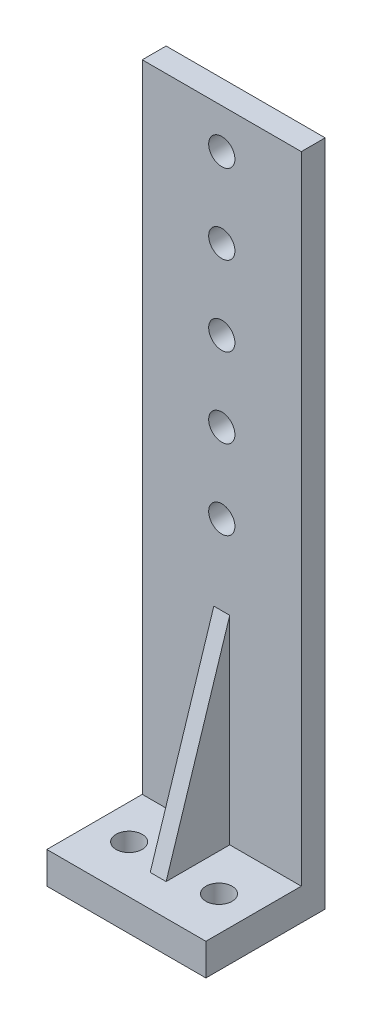
ISO-10303-21;
HEADER;
FILE_DESCRIPTION(('STEP AP214'),'2;1');
FILE_NAME('part.step','',(''),(''),'','','');
FILE_SCHEMA(('AUTOMOTIVE_DESIGN { 1 0 10303 214 1 1 1 1 }'));
ENDSEC;
DATA;
#1=APPLICATION_CONTEXT('core data for automotive mechanical design processes');
#2=APPLICATION_PROTOCOL_DEFINITION('international standard','automotive_design',2000,#1);
#3=PRODUCT_CONTEXT('',#1,'mechanical');
#4=PRODUCT('Part','Part','',(#3));
#5=PRODUCT_RELATED_PRODUCT_CATEGORY('part','',(#4));
#6=PRODUCT_DEFINITION_FORMATION('','',#4);
#7=PRODUCT_DEFINITION_CONTEXT('part definition',#1,'design');
#8=PRODUCT_DEFINITION('design','',#6,#7);
#9=PRODUCT_DEFINITION_SHAPE('','',#8);
#10=(LENGTH_UNIT() NAMED_UNIT(*) SI_UNIT(.MILLI.,.METRE.));
#11=(NAMED_UNIT(*) PLANE_ANGLE_UNIT() SI_UNIT($,.RADIAN.));
#12=(NAMED_UNIT(*) SI_UNIT($,.STERADIAN.) SOLID_ANGLE_UNIT());
#13=UNCERTAINTY_MEASURE_WITH_UNIT(LENGTH_MEASURE(1.E-05),#10,'distance_accuracy_value','');
#14=(GEOMETRIC_REPRESENTATION_CONTEXT(3) GLOBAL_UNCERTAINTY_ASSIGNED_CONTEXT((#13)) GLOBAL_UNIT_ASSIGNED_CONTEXT((#10,
#11,#12)) REPRESENTATION_CONTEXT('',''));
#15=CARTESIAN_POINT('',(0.,0.,0.));
#16=DIRECTION('',(0.,0.,1.));
#17=DIRECTION('',(1.,0.,0.));
#18=AXIS2_PLACEMENT_3D('',#15,#16,#17);
#19=CARTESIAN_POINT('',(0.,4.,0.));
#20=DIRECTION('',(0.,1.,0.));
#21=DIRECTION('',(0.,0.,1.));
#22=AXIS2_PLACEMENT_3D('',#19,#20,#21);
#23=PLANE('',#22);
#24=CARTESIAN_POINT('',(-5.65,4.,0.));
#25=DIRECTION('',(0.,1.,0.));
#26=DIRECTION('',(0.,0.,1.));
#27=AXIS2_PLACEMENT_3D('',#24,#25,#26);
#28=CIRCLE('',#27,1.65);
#29=CARTESIAN_POINT('',(-5.65,4.,1.65));
#30=VERTEX_POINT('',#29);
#31=EDGE_CURVE('E195',#30,#30,#28,.T.);
#32=ORIENTED_EDGE('',*,*,#31,.F.);
#33=EDGE_LOOP('',(#32));
#34=FACE_BOUND('',#33,.T.);
#35=CARTESIAN_POINT('',(5.65,4.,0.));
#36=DIRECTION('',(0.,1.,0.));
#37=DIRECTION('',(0.,0.,1.));
#38=AXIS2_PLACEMENT_3D('',#35,#36,#37);
#39=CIRCLE('',#38,1.65);
#40=CARTESIAN_POINT('',(5.65,4.,1.65));
#41=VERTEX_POINT('',#40);
#42=EDGE_CURVE('E187',#41,#41,#39,.T.);
#43=ORIENTED_EDGE('',*,*,#42,.F.);
#44=EDGE_LOOP('',(#43));
#45=FACE_BOUND('',#44,.T.);
#46=DIRECTION('',(1.,0.,0.));
#47=VECTOR('',#46,1.);
#48=CARTESIAN_POINT('',(-1.,4.,2.));
#49=LINE('',#48,#47);
#50=CARTESIAN_POINT('',(-1.,4.,2.));
#51=VERTEX_POINT('',#50);
#52=CARTESIAN_POINT('',(1.,4.,2.));
#53=VERTEX_POINT('',#52);
#54=EDGE_CURVE('E120',#51,#53,#49,.T.);
#55=ORIENTED_EDGE('',*,*,#54,.F.);
#56=DIRECTION('',(0.,0.,-1.));
#57=VECTOR('',#56,1.);
#58=CARTESIAN_POINT('',(-1.,4.,2.));
#59=LINE('',#58,#57);
#60=CARTESIAN_POINT('',(-1.,4.,-6.));
#61=VERTEX_POINT('',#60);
#62=EDGE_CURVE('E146',#51,#61,#59,.T.);
#63=ORIENTED_EDGE('',*,*,#62,.T.);
#64=DIRECTION('',(-1.,0.,0.));
#65=VECTOR('',#64,1.);
#66=CARTESIAN_POINT('',(10.,4.,-6.));
#67=LINE('',#66,#65);
#68=CARTESIAN_POINT('',(-10.,4.,-6.));
#69=VERTEX_POINT('',#68);
#70=EDGE_CURVE('E64',#61,#69,#67,.T.);
#71=ORIENTED_EDGE('',*,*,#70,.T.);
#72=DIRECTION('',(0.,0.,1.));
#73=VECTOR('',#72,1.);
#74=CARTESIAN_POINT('',(-10.,4.,6.));
#75=LINE('',#74,#73);
#76=CARTESIAN_POINT('',(-10.,4.,6.));
#77=VERTEX_POINT('',#76);
#78=EDGE_CURVE('E203',#69,#77,#75,.T.);
#79=ORIENTED_EDGE('',*,*,#78,.T.);
#80=DIRECTION('',(1.,0.,0.));
#81=VECTOR('',#80,1.);
#82=CARTESIAN_POINT('',(10.,4.,6.));
#83=LINE('',#82,#81);
#84=CARTESIAN_POINT('',(10.,4.,6.));
#85=VERTEX_POINT('',#84);
#86=EDGE_CURVE('E81',#77,#85,#83,.T.);
#87=ORIENTED_EDGE('',*,*,#86,.T.);
#88=DIRECTION('',(0.,0.,-1.));
#89=VECTOR('',#88,1.);
#90=CARTESIAN_POINT('',(10.,4.,6.));
#91=LINE('',#90,#89);
#92=CARTESIAN_POINT('',(10.,4.00000000000003,-6.));
#93=VERTEX_POINT('',#92);
#94=EDGE_CURVE('E209',#85,#93,#91,.T.);
#95=ORIENTED_EDGE('',*,*,#94,.T.);
#96=CARTESIAN_POINT('',(0.999999999999997,4.,-6.));
#97=VERTEX_POINT('',#96);
#98=EDGE_CURVE('E137',#93,#97,#67,.T.);
#99=ORIENTED_EDGE('',*,*,#98,.T.);
#100=DIRECTION('',(0.,0.,-1.));
#101=VECTOR('',#100,1.);
#102=CARTESIAN_POINT('',(1.,4.,2.));
#103=LINE('',#102,#101);
#104=EDGE_CURVE('E55',#53,#97,#103,.T.);
#105=ORIENTED_EDGE('',*,*,#104,.F.);
#106=EDGE_LOOP('',(#55,#63,#71,#79,#87,#95,#99,#105));
#107=FACE_BOUND('',#106,.T.);
#108=ADVANCED_FACE('F39',(#34,#45,#107),#23,.T.);
#109=CARTESIAN_POINT('',(-10.,84.,-6.));
#110=DIRECTION('',(0.,0.,-1.));
#111=DIRECTION('',(-1.,0.,0.));
#112=AXIS2_PLACEMENT_3D('',#109,#110,#111);
#113=PLANE('',#112);
#114=CARTESIAN_POINT('',(0.,39.,-6.));
#115=DIRECTION('',(0.,0.,1.));
#116=DIRECTION('',(1.,0.,0.));
#117=AXIS2_PLACEMENT_3D('',#114,#115,#116);
#118=CIRCLE('',#117,1.65);
#119=CARTESIAN_POINT('',(1.65,39.,-6.));
#120=VERTEX_POINT('',#119);
#121=EDGE_CURVE('E429',#120,#120,#118,.T.);
#122=ORIENTED_EDGE('',*,*,#121,.F.);
#123=EDGE_LOOP('',(#122));
#124=FACE_BOUND('',#123,.T.);
#125=CARTESIAN_POINT('',(0.,49.,-6.));
#126=DIRECTION('',(0.,0.,1.));
#127=DIRECTION('',(1.,0.,0.));
#128=AXIS2_PLACEMENT_3D('',#125,#126,#127);
#129=CIRCLE('',#128,1.65);
#130=CARTESIAN_POINT('',(1.65,49.,-6.));
#131=VERTEX_POINT('',#130);
#132=EDGE_CURVE('E437',#131,#131,#129,.T.);
#133=ORIENTED_EDGE('',*,*,#132,.F.);
#134=EDGE_LOOP('',(#133));
#135=FACE_BOUND('',#134,.T.);
#136=CARTESIAN_POINT('',(0.,59.,-6.));
#137=DIRECTION('',(0.,0.,1.));
#138=DIRECTION('',(1.,0.,0.));
#139=AXIS2_PLACEMENT_3D('',#136,#137,#138);
#140=CIRCLE('',#139,1.65);
#141=CARTESIAN_POINT('',(1.65,59.,-6.));
#142=VERTEX_POINT('',#141);
#143=EDGE_CURVE('E444',#142,#142,#140,.T.);
#144=ORIENTED_EDGE('',*,*,#143,.F.);
#145=EDGE_LOOP('',(#144));
#146=FACE_BOUND('',#145,.T.);
#147=CARTESIAN_POINT('',(0.,69.,-6.));
#148=DIRECTION('',(0.,0.,1.));
#149=DIRECTION('',(1.,0.,0.));
#150=AXIS2_PLACEMENT_3D('',#147,#148,#149);
#151=CIRCLE('',#150,1.65);
#152=CARTESIAN_POINT('',(1.65,69.,-6.));
#153=VERTEX_POINT('',#152);
#154=EDGE_CURVE('E452',#153,#153,#151,.T.);
#155=ORIENTED_EDGE('',*,*,#154,.F.);
#156=EDGE_LOOP('',(#155));
#157=FACE_BOUND('',#156,.T.);
#158=CARTESIAN_POINT('',(0.,79.,-6.));
#159=DIRECTION('',(0.,0.,1.));
#160=DIRECTION('',(1.,0.,0.));
#161=AXIS2_PLACEMENT_3D('',#158,#159,#160);
#162=CIRCLE('',#161,1.65);
#163=CARTESIAN_POINT('',(1.65,79.,-6.));
#164=VERTEX_POINT('',#163);
#165=EDGE_CURVE('E460',#164,#164,#162,.T.);
#166=ORIENTED_EDGE('',*,*,#165,.F.);
#167=EDGE_LOOP('',(#166));
#168=FACE_BOUND('',#167,.T.);
#169=DIRECTION('',(0.,1.,0.));
#170=VECTOR('',#169,1.);
#171=CARTESIAN_POINT('',(-1.,4.,-6.));
#172=LINE('',#171,#170);
#173=CARTESIAN_POINT('',(-1.,29.,-6.));
#174=VERTEX_POINT('',#173);
#175=EDGE_CURVE('E128',#61,#174,#172,.T.);
#176=ORIENTED_EDGE('',*,*,#175,.T.);
#177=DIRECTION('',(1.,0.,0.));
#178=VECTOR('',#177,1.);
#179=CARTESIAN_POINT('',(-1.,29.,-6.));
#180=LINE('',#179,#178);
#181=CARTESIAN_POINT('',(1.,29.,-6.));
#182=VERTEX_POINT('',#181);
#183=EDGE_CURVE('E127',#174,#182,#180,.T.);
#184=ORIENTED_EDGE('',*,*,#183,.T.);
#185=DIRECTION('',(0.,1.,0.));
#186=VECTOR('',#185,1.);
#187=CARTESIAN_POINT('',(1.,4.,-6.));
#188=LINE('',#187,#186);
#189=EDGE_CURVE('E131',#97,#182,#188,.T.);
#190=ORIENTED_EDGE('',*,*,#189,.F.);
#191=ORIENTED_EDGE('',*,*,#98,.F.);
#192=DIRECTION('',(0.,-1.,0.));
#193=VECTOR('',#192,1.);
#194=CARTESIAN_POINT('',(10.,84.,-6.));
#195=LINE('',#194,#193);
#196=CARTESIAN_POINT('',(10.,84.,-6.));
#197=VERTEX_POINT('',#196);
#198=EDGE_CURVE('E179',#197,#93,#195,.T.);
#199=ORIENTED_EDGE('',*,*,#198,.F.);
#200=DIRECTION('',(1.,0.,0.));
#201=VECTOR('',#200,1.);
#202=CARTESIAN_POINT('',(-10.,84.,-6.));
#203=LINE('',#202,#201);
#204=CARTESIAN_POINT('',(-10.,84.,-6.));
#205=VERTEX_POINT('',#204);
#206=EDGE_CURVE('E159',#205,#197,#203,.T.);
#207=ORIENTED_EDGE('',*,*,#206,.F.);
#208=DIRECTION('',(0.,-1.,0.));
#209=VECTOR('',#208,1.);
#210=CARTESIAN_POINT('',(-10.,84.,-6.));
#211=LINE('',#210,#209);
#212=EDGE_CURVE('E183',#205,#69,#211,.T.);
#213=ORIENTED_EDGE('',*,*,#212,.T.);
#214=ORIENTED_EDGE('',*,*,#70,.F.);
#215=EDGE_LOOP('',(#176,#184,#190,#191,#199,#207,#213,#214));
#216=FACE_BOUND('',#215,.T.);
#217=ADVANCED_FACE('F253',(#124,#135,#146,#157,#168,#216),#113,.F.);
#218=CARTESIAN_POINT('',(0.,0.,0.));
#219=DIRECTION('',(0.,1.,0.));
#220=DIRECTION('',(0.,0.,1.));
#221=AXIS2_PLACEMENT_3D('',#218,#219,#220);
#222=PLANE('',#221);
#223=DIRECTION('',(0.,0.,1.));
#224=VECTOR('',#223,1.);
#225=CARTESIAN_POINT('',(-10.,0.,6.));
#226=LINE('',#225,#224);
#227=CARTESIAN_POINT('',(-10.,0.,-9.));
#228=VERTEX_POINT('',#227);
#229=CARTESIAN_POINT('',(-10.,0.,6.));
#230=VERTEX_POINT('',#229);
#231=EDGE_CURVE('E199',#228,#230,#226,.T.);
#232=ORIENTED_EDGE('',*,*,#231,.F.);
#233=DIRECTION('',(-1.,0.,0.));
#234=VECTOR('',#233,1.);
#235=CARTESIAN_POINT('',(-10.,0.,-9.));
#236=LINE('',#235,#234);
#237=CARTESIAN_POINT('',(10.,0.,-9.));
#238=VERTEX_POINT('',#237);
#239=EDGE_CURVE('E153',#238,#228,#236,.T.);
#240=ORIENTED_EDGE('',*,*,#239,.F.);
#241=DIRECTION('',(0.,0.,-1.));
#242=VECTOR('',#241,1.);
#243=CARTESIAN_POINT('',(10.,0.,6.));
#244=LINE('',#243,#242);
#245=CARTESIAN_POINT('',(10.,0.,6.));
#246=VERTEX_POINT('',#245);
#247=EDGE_CURVE('E206',#246,#238,#244,.T.);
#248=ORIENTED_EDGE('',*,*,#247,.F.);
#249=DIRECTION('',(1.,0.,0.));
#250=VECTOR('',#249,1.);
#251=CARTESIAN_POINT('',(10.,0.,6.));
#252=LINE('',#251,#250);
#253=EDGE_CURVE('E78',#230,#246,#252,.T.);
#254=ORIENTED_EDGE('',*,*,#253,.F.);
#255=EDGE_LOOP('',(#232,#240,#248,#254));
#256=FACE_BOUND('',#255,.T.);
#257=CARTESIAN_POINT('',(-5.65,0.,0.));
#258=DIRECTION('',(0.,1.,0.));
#259=DIRECTION('',(0.,0.,1.));
#260=AXIS2_PLACEMENT_3D('',#257,#258,#259);
#261=CIRCLE('',#260,1.65);
#262=CARTESIAN_POINT('',(-5.65,0.,1.65));
#263=VERTEX_POINT('',#262);
#264=EDGE_CURVE('E191',#263,#263,#261,.T.);
#265=ORIENTED_EDGE('',*,*,#264,.T.);
#266=EDGE_LOOP('',(#265));
#267=FACE_BOUND('',#266,.T.);
#268=CARTESIAN_POINT('',(5.65,0.,0.));
#269=DIRECTION('',(0.,1.,0.));
#270=DIRECTION('',(0.,0.,1.));
#271=AXIS2_PLACEMENT_3D('',#268,#269,#270);
#272=CIRCLE('',#271,1.65);
#273=CARTESIAN_POINT('',(5.65,0.,1.65));
#274=VERTEX_POINT('',#273);
#275=EDGE_CURVE('E186',#274,#274,#272,.T.);
#276=ORIENTED_EDGE('',*,*,#275,.T.);
#277=EDGE_LOOP('',(#276));
#278=FACE_BOUND('',#277,.T.);
#279=ADVANCED_FACE('F228',(#256,#267,#278),#222,.F.);
#280=CARTESIAN_POINT('',(-10.,4.,6.));
#281=DIRECTION('',(1.,0.,0.));
#282=DIRECTION('',(0.,0.,-1.));
#283=AXIS2_PLACEMENT_3D('',#280,#281,#282);
#284=PLANE('',#283);
#285=ORIENTED_EDGE('',*,*,#231,.T.);
#286=DIRECTION('',(0.,-1.,0.));
#287=VECTOR('',#286,1.);
#288=CARTESIAN_POINT('',(-10.,4.,6.));
#289=LINE('',#288,#287);
#290=EDGE_CURVE('E11',#77,#230,#289,.T.);
#291=ORIENTED_EDGE('',*,*,#290,.F.);
#292=ORIENTED_EDGE('',*,*,#78,.F.);
#293=ORIENTED_EDGE('',*,*,#212,.F.);
#294=DIRECTION('',(0.,0.,1.));
#295=VECTOR('',#294,1.);
#296=CARTESIAN_POINT('',(-10.,84.,-6.));
#297=LINE('',#296,#295);
#298=CARTESIAN_POINT('',(-10.,84.,-9.));
#299=VERTEX_POINT('',#298);
#300=EDGE_CURVE('E155',#299,#205,#297,.T.);
#301=ORIENTED_EDGE('',*,*,#300,.F.);
#302=DIRECTION('',(0.,-1.,0.));
#303=VECTOR('',#302,1.);
#304=CARTESIAN_POINT('',(-10.,84.,-9.));
#305=LINE('',#304,#303);
#306=EDGE_CURVE('E168',#299,#228,#305,.T.);
#307=ORIENTED_EDGE('',*,*,#306,.T.);
#308=EDGE_LOOP('',(#285,#291,#292,#293,#301,#307));
#309=FACE_BOUND('',#308,.T.);
#310=ADVANCED_FACE('F41',(#309),#284,.F.);
#311=CARTESIAN_POINT('',(10.,4.,6.));
#312=DIRECTION('',(0.,0.,-1.));
#313=DIRECTION('',(-1.,0.,0.));
#314=AXIS2_PLACEMENT_3D('',#311,#312,#313);
#315=PLANE('',#314);
#316=ORIENTED_EDGE('',*,*,#253,.T.);
#317=DIRECTION('',(0.,-1.,0.));
#318=VECTOR('',#317,1.);
#319=CARTESIAN_POINT('',(10.,4.,6.));
#320=LINE('',#319,#318);
#321=EDGE_CURVE('E48',#85,#246,#320,.T.);
#322=ORIENTED_EDGE('',*,*,#321,.F.);
#323=ORIENTED_EDGE('',*,*,#86,.F.);
#324=ORIENTED_EDGE('',*,*,#290,.T.);
#325=EDGE_LOOP('',(#316,#322,#323,#324));
#326=FACE_BOUND('',#325,.T.);
#327=ADVANCED_FACE('F244',(#326),#315,.F.);
#328=CARTESIAN_POINT('',(10.,4.,6.));
#329=DIRECTION('',(-1.,0.,0.));
#330=DIRECTION('',(0.,0.,1.));
#331=AXIS2_PLACEMENT_3D('',#328,#329,#330);
#332=PLANE('',#331);
#333=ORIENTED_EDGE('',*,*,#247,.T.);
#334=DIRECTION('',(0.,-1.,0.));
#335=VECTOR('',#334,1.);
#336=CARTESIAN_POINT('',(10.,84.,-9.));
#337=LINE('',#336,#335);
#338=CARTESIAN_POINT('',(10.,84.,-9.));
#339=VERTEX_POINT('',#338);
#340=EDGE_CURVE('E175',#339,#238,#337,.T.);
#341=ORIENTED_EDGE('',*,*,#340,.F.);
#342=DIRECTION('',(0.,0.,-1.));
#343=VECTOR('',#342,1.);
#344=CARTESIAN_POINT('',(10.,84.,-6.));
#345=LINE('',#344,#343);
#346=EDGE_CURVE('E162',#197,#339,#345,.T.);
#347=ORIENTED_EDGE('',*,*,#346,.F.);
#348=ORIENTED_EDGE('',*,*,#198,.T.);
#349=ORIENTED_EDGE('',*,*,#94,.F.);
#350=ORIENTED_EDGE('',*,*,#321,.T.);
#351=EDGE_LOOP('',(#333,#341,#347,#348,#349,#350));
#352=FACE_BOUND('',#351,.T.);
#353=ADVANCED_FACE('F224',(#352),#332,.F.);
#354=CARTESIAN_POINT('',(-5.65,4.,0.));
#355=DIRECTION('',(0.,-1.,0.));
#356=DIRECTION('',(0.,0.,-1.));
#357=AXIS2_PLACEMENT_3D('',#354,#355,#356);
#358=CYLINDRICAL_SURFACE('',#357,1.65);
#359=ORIENTED_EDGE('',*,*,#31,.T.);
#360=EDGE_LOOP('',(#359));
#361=FACE_BOUND('',#360,.T.);
#362=ORIENTED_EDGE('',*,*,#264,.F.);
#363=EDGE_LOOP('',(#362));
#364=FACE_BOUND('',#363,.T.);
#365=ADVANCED_FACE('F250',(#361,#364),#358,.F.);
#366=CARTESIAN_POINT('',(5.65,4.,0.));
#367=DIRECTION('',(0.,-1.,0.));
#368=DIRECTION('',(0.,0.,-1.));
#369=AXIS2_PLACEMENT_3D('',#366,#367,#368);
#370=CYLINDRICAL_SURFACE('',#369,1.65);
#371=ORIENTED_EDGE('',*,*,#42,.T.);
#372=EDGE_LOOP('',(#371));
#373=FACE_BOUND('',#372,.T.);
#374=ORIENTED_EDGE('',*,*,#275,.F.);
#375=EDGE_LOOP('',(#374));
#376=FACE_BOUND('',#375,.T.);
#377=ADVANCED_FACE('F339',(#373,#376),#370,.F.);
#378=CARTESIAN_POINT('',(-10.,84.,-9.));
#379=DIRECTION('',(0.,0.,1.));
#380=DIRECTION('',(1.,0.,0.));
#381=AXIS2_PLACEMENT_3D('',#378,#379,#380);
#382=PLANE('',#381);
#383=CARTESIAN_POINT('',(0.,39.,-9.));
#384=DIRECTION('',(0.,0.,1.));
#385=DIRECTION('',(1.,0.,0.));
#386=AXIS2_PLACEMENT_3D('',#383,#384,#385);
#387=CIRCLE('',#386,1.65);
#388=CARTESIAN_POINT('',(1.65,39.,-9.));
#389=VERTEX_POINT('',#388);
#390=EDGE_CURVE('E133',#389,#389,#387,.F.);
#391=ORIENTED_EDGE('',*,*,#390,.F.);
#392=EDGE_LOOP('',(#391));
#393=FACE_BOUND('',#392,.T.);
#394=CARTESIAN_POINT('',(0.,49.,-9.));
#395=DIRECTION('',(0.,0.,1.));
#396=DIRECTION('',(1.,0.,0.));
#397=AXIS2_PLACEMENT_3D('',#394,#395,#396);
#398=CIRCLE('',#397,1.65);
#399=CARTESIAN_POINT('',(1.65,49.,-9.));
#400=VERTEX_POINT('',#399);
#401=EDGE_CURVE('E431',#400,#400,#398,.F.);
#402=ORIENTED_EDGE('',*,*,#401,.F.);
#403=EDGE_LOOP('',(#402));
#404=FACE_BOUND('',#403,.T.);
#405=CARTESIAN_POINT('',(0.,59.,-9.));
#406=DIRECTION('',(0.,0.,1.));
#407=DIRECTION('',(1.,0.,0.));
#408=AXIS2_PLACEMENT_3D('',#405,#406,#407);
#409=CIRCLE('',#408,1.65);
#410=CARTESIAN_POINT('',(1.65,59.,-9.));
#411=VERTEX_POINT('',#410);
#412=EDGE_CURVE('E442',#411,#411,#409,.F.);
#413=ORIENTED_EDGE('',*,*,#412,.F.);
#414=EDGE_LOOP('',(#413));
#415=FACE_BOUND('',#414,.T.);
#416=CARTESIAN_POINT('',(0.,69.,-9.));
#417=DIRECTION('',(0.,0.,1.));
#418=DIRECTION('',(1.,0.,0.));
#419=AXIS2_PLACEMENT_3D('',#416,#417,#418);
#420=CIRCLE('',#419,1.65);
#421=CARTESIAN_POINT('',(1.65,69.,-9.));
#422=VERTEX_POINT('',#421);
#423=EDGE_CURVE('E448',#422,#422,#420,.F.);
#424=ORIENTED_EDGE('',*,*,#423,.F.);
#425=EDGE_LOOP('',(#424));
#426=FACE_BOUND('',#425,.T.);
#427=CARTESIAN_POINT('',(0.,79.,-9.));
#428=DIRECTION('',(0.,0.,1.));
#429=DIRECTION('',(1.,0.,0.));
#430=AXIS2_PLACEMENT_3D('',#427,#428,#429);
#431=CIRCLE('',#430,1.65);
#432=CARTESIAN_POINT('',(1.65,79.,-9.));
#433=VERTEX_POINT('',#432);
#434=EDGE_CURVE('E456',#433,#433,#431,.F.);
#435=ORIENTED_EDGE('',*,*,#434,.F.);
#436=EDGE_LOOP('',(#435));
#437=FACE_BOUND('',#436,.T.);
#438=ORIENTED_EDGE('',*,*,#239,.T.);
#439=ORIENTED_EDGE('',*,*,#306,.F.);
#440=DIRECTION('',(-1.,0.,0.));
#441=VECTOR('',#440,1.);
#442=CARTESIAN_POINT('',(-10.,84.,-9.));
#443=LINE('',#442,#441);
#444=EDGE_CURVE('E165',#339,#299,#443,.T.);
#445=ORIENTED_EDGE('',*,*,#444,.F.);
#446=ORIENTED_EDGE('',*,*,#340,.T.);
#447=EDGE_LOOP('',(#438,#439,#445,#446));
#448=FACE_BOUND('',#447,.T.);
#449=ADVANCED_FACE('F232',(#393,#404,#415,#426,#437,#448),#382,.F.);
#450=CARTESIAN_POINT('',(0.,84.,0.));
#451=DIRECTION('',(0.,-1.,0.));
#452=DIRECTION('',(0.,0.,-1.));
#453=AXIS2_PLACEMENT_3D('',#450,#451,#452);
#454=PLANE('',#453);
#455=ORIENTED_EDGE('',*,*,#300,.T.);
#456=ORIENTED_EDGE('',*,*,#206,.T.);
#457=ORIENTED_EDGE('',*,*,#346,.T.);
#458=ORIENTED_EDGE('',*,*,#444,.T.);
#459=EDGE_LOOP('',(#455,#456,#457,#458));
#460=FACE_BOUND('',#459,.T.);
#461=ADVANCED_FACE('F240',(#460),#454,.F.);
#462=CARTESIAN_POINT('',(-1.,29.,-6.));
#463=DIRECTION('',(0.,0.304775727103784,0.952424147199324));
#464=DIRECTION('',(0.,-0.952424147199324,0.304775727103784));
#465=AXIS2_PLACEMENT_3D('',#462,#463,#464);
#466=PLANE('',#465);
#467=ORIENTED_EDGE('',*,*,#54,.T.);
#468=DIRECTION('',(0.,-0.952424147199324,0.304775727103784));
#469=VECTOR('',#468,1.);
#470=CARTESIAN_POINT('',(1.,29.,-6.));
#471=LINE('',#470,#469);
#472=EDGE_CURVE('E122',#182,#53,#471,.T.);
#473=ORIENTED_EDGE('',*,*,#472,.F.);
#474=ORIENTED_EDGE('',*,*,#183,.F.);
#475=DIRECTION('',(0.,-0.952424147199324,0.304775727103784));
#476=VECTOR('',#475,1.);
#477=CARTESIAN_POINT('',(-1.,29.,-6.));
#478=LINE('',#477,#476);
#479=EDGE_CURVE('E125',#174,#51,#478,.T.);
#480=ORIENTED_EDGE('',*,*,#479,.T.);
#481=EDGE_LOOP('',(#467,#473,#474,#480));
#482=FACE_BOUND('',#481,.T.);
#483=ADVANCED_FACE('F121',(#482),#466,.T.);
#484=CARTESIAN_POINT('',(-1.,0.,0.));
#485=DIRECTION('',(1.,0.,0.));
#486=DIRECTION('',(0.,0.,-1.));
#487=AXIS2_PLACEMENT_3D('',#484,#485,#486);
#488=PLANE('',#487);
#489=ORIENTED_EDGE('',*,*,#479,.F.);
#490=ORIENTED_EDGE('',*,*,#175,.F.);
#491=ORIENTED_EDGE('',*,*,#62,.F.);
#492=EDGE_LOOP('',(#489,#490,#491));
#493=FACE_BOUND('',#492,.T.);
#494=ADVANCED_FACE('F309',(#493),#488,.F.);
#495=CARTESIAN_POINT('',(1.,0.,0.));
#496=DIRECTION('',(1.,0.,0.));
#497=DIRECTION('',(0.,0.,-1.));
#498=AXIS2_PLACEMENT_3D('',#495,#496,#497);
#499=PLANE('',#498);
#500=ORIENTED_EDGE('',*,*,#472,.T.);
#501=ORIENTED_EDGE('',*,*,#104,.T.);
#502=ORIENTED_EDGE('',*,*,#189,.T.);
#503=EDGE_LOOP('',(#500,#501,#502));
#504=FACE_BOUND('',#503,.T.);
#505=ADVANCED_FACE('F130',(#504),#499,.T.);
#506=CARTESIAN_POINT('',(0.,79.,-13.6669047558312));
#507=DIRECTION('',(0.,0.,1.));
#508=DIRECTION('',(1.,0.,0.));
#509=AXIS2_PLACEMENT_3D('',#506,#507,#508);
#510=CYLINDRICAL_SURFACE('',#509,1.65);
#511=ORIENTED_EDGE('',*,*,#434,.T.);
#512=EDGE_LOOP('',(#511));
#513=FACE_BOUND('',#512,.T.);
#514=ORIENTED_EDGE('',*,*,#165,.T.);
#515=EDGE_LOOP('',(#514));
#516=FACE_BOUND('',#515,.T.);
#517=ADVANCED_FACE('F326',(#513,#516),#510,.F.);
#518=CARTESIAN_POINT('',(0.,69.,-13.6669047558312));
#519=DIRECTION('',(0.,0.,1.));
#520=DIRECTION('',(1.,0.,0.));
#521=AXIS2_PLACEMENT_3D('',#518,#519,#520);
#522=CYLINDRICAL_SURFACE('',#521,1.65);
#523=ORIENTED_EDGE('',*,*,#423,.T.);
#524=EDGE_LOOP('',(#523));
#525=FACE_BOUND('',#524,.T.);
#526=ORIENTED_EDGE('',*,*,#154,.T.);
#527=EDGE_LOOP('',(#526));
#528=FACE_BOUND('',#527,.T.);
#529=ADVANCED_FACE('F348',(#525,#528),#522,.F.);
#530=CARTESIAN_POINT('',(0.,59.,-13.6669047558312));
#531=DIRECTION('',(0.,0.,1.));
#532=DIRECTION('',(1.,0.,0.));
#533=AXIS2_PLACEMENT_3D('',#530,#531,#532);
#534=CYLINDRICAL_SURFACE('',#533,1.65);
#535=ORIENTED_EDGE('',*,*,#412,.T.);
#536=EDGE_LOOP('',(#535));
#537=FACE_BOUND('',#536,.T.);
#538=ORIENTED_EDGE('',*,*,#143,.T.);
#539=EDGE_LOOP('',(#538));
#540=FACE_BOUND('',#539,.T.);
#541=ADVANCED_FACE('F358',(#537,#540),#534,.F.);
#542=CARTESIAN_POINT('',(0.,49.,-13.6669047558312));
#543=DIRECTION('',(0.,0.,1.));
#544=DIRECTION('',(1.,0.,0.));
#545=AXIS2_PLACEMENT_3D('',#542,#543,#544);
#546=CYLINDRICAL_SURFACE('',#545,1.65);
#547=ORIENTED_EDGE('',*,*,#401,.T.);
#548=EDGE_LOOP('',(#547));
#549=FACE_BOUND('',#548,.T.);
#550=ORIENTED_EDGE('',*,*,#132,.T.);
#551=EDGE_LOOP('',(#550));
#552=FACE_BOUND('',#551,.T.);
#553=ADVANCED_FACE('F368',(#549,#552),#546,.F.);
#554=CARTESIAN_POINT('',(0.,39.,-13.6669047558312));
#555=DIRECTION('',(0.,0.,1.));
#556=DIRECTION('',(1.,0.,0.));
#557=AXIS2_PLACEMENT_3D('',#554,#555,#556);
#558=CYLINDRICAL_SURFACE('',#557,1.65);
#559=ORIENTED_EDGE('',*,*,#390,.T.);
#560=EDGE_LOOP('',(#559));
#561=FACE_BOUND('',#560,.T.);
#562=ORIENTED_EDGE('',*,*,#121,.T.);
#563=EDGE_LOOP('',(#562));
#564=FACE_BOUND('',#563,.T.);
#565=ADVANCED_FACE('F378',(#561,#564),#558,.F.);
#566=CLOSED_SHELL('',(#108,#217,#279,#310,#327,#353,#365,#377,#449,#461,#483,#494,#505,#517,
#529,#541,#553,#565));
#567=MANIFOLD_SOLID_BREP('B2',#566);
#568=ADVANCED_BREP_SHAPE_REPRESENTATION('',(#18,#567),#14);
#569=SHAPE_DEFINITION_REPRESENTATION(#9,#568);
ENDSEC;
END-ISO-10303-21;
